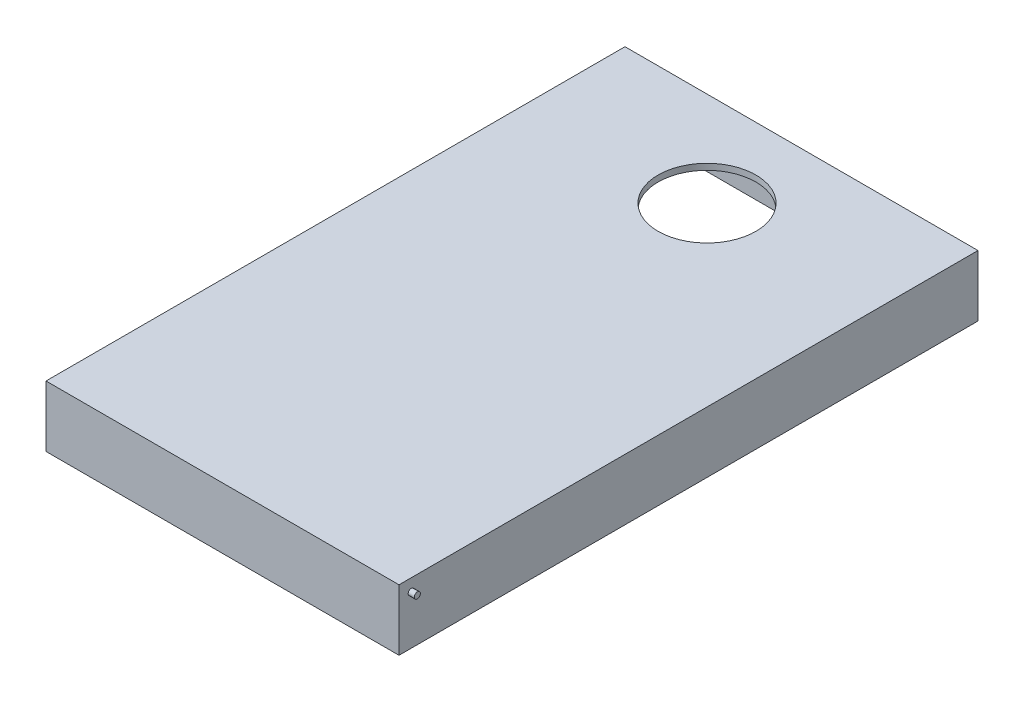
ISO-10303-21;
HEADER;
FILE_DESCRIPTION(('STEP AP214'),'2;1');
FILE_NAME('part.step','',(''),(''),'','','');
FILE_SCHEMA(('AUTOMOTIVE_DESIGN { 1 0 10303 214 1 1 1 1 }'));
ENDSEC;
DATA;
#1=APPLICATION_CONTEXT('core data for automotive mechanical design processes');
#2=APPLICATION_PROTOCOL_DEFINITION('international standard','automotive_design',2000,#1);
#3=PRODUCT_CONTEXT('',#1,'mechanical');
#4=PRODUCT('Part','Part','',(#3));
#5=PRODUCT_RELATED_PRODUCT_CATEGORY('part','',(#4));
#6=PRODUCT_DEFINITION_FORMATION('','',#4);
#7=PRODUCT_DEFINITION_CONTEXT('part definition',#1,'design');
#8=PRODUCT_DEFINITION('design','',#6,#7);
#9=PRODUCT_DEFINITION_SHAPE('','',#8);
#10=(LENGTH_UNIT() NAMED_UNIT(*) SI_UNIT(.MILLI.,.METRE.));
#11=(NAMED_UNIT(*) PLANE_ANGLE_UNIT() SI_UNIT($,.RADIAN.));
#12=(NAMED_UNIT(*) SI_UNIT($,.STERADIAN.) SOLID_ANGLE_UNIT());
#13=UNCERTAINTY_MEASURE_WITH_UNIT(LENGTH_MEASURE(1.E-05),#10,'distance_accuracy_value','');
#14=(GEOMETRIC_REPRESENTATION_CONTEXT(3) GLOBAL_UNCERTAINTY_ASSIGNED_CONTEXT((#13)) GLOBAL_UNIT_ASSIGNED_CONTEXT((#10,
#11,#12)) REPRESENTATION_CONTEXT('',''));
#15=CARTESIAN_POINT('',(0.,0.,0.));
#16=DIRECTION('',(0.,0.,1.));
#17=DIRECTION('',(1.,0.,0.));
#18=AXIS2_PLACEMENT_3D('',#15,#16,#17);
#19=CARTESIAN_POINT('',(0.,-10.,0.));
#20=DIRECTION('',(0.,-1.,0.));
#21=DIRECTION('',(0.,0.,-1.));
#22=AXIS2_PLACEMENT_3D('',#19,#20,#21);
#23=PLANE('',#22);
#24=DIRECTION('',(1.,0.,0.));
#25=VECTOR('',#24,1.);
#26=CARTESIAN_POINT('',(28.9,-10.,-24.0111111111109));
#27=LINE('',#26,#25);
#28=CARTESIAN_POINT('',(-28.9,-10.,-24.0111111111109));
#29=VERTEX_POINT('',#28);
#30=CARTESIAN_POINT('',(28.9,-10.,-24.0111111111109));
#31=VERTEX_POINT('',#30);
#32=EDGE_CURVE('E148',#29,#31,#27,.T.);
#33=ORIENTED_EDGE('',*,*,#32,.F.);
#34=DIRECTION('',(0.,0.,1.));
#35=VECTOR('',#34,1.);
#36=CARTESIAN_POINT('',(-28.9,-10.,-24.0111111111109));
#37=LINE('',#36,#35);
#38=CARTESIAN_POINT('',(-28.9,-10.,-118.811111111111));
#39=VERTEX_POINT('',#38);
#40=EDGE_CURVE('E156',#39,#29,#37,.T.);
#41=ORIENTED_EDGE('',*,*,#40,.F.);
#42=DIRECTION('',(-1.,0.,0.));
#43=VECTOR('',#42,1.);
#44=CARTESIAN_POINT('',(28.9,-10.,-118.811111111111));
#45=LINE('',#44,#43);
#46=CARTESIAN_POINT('',(28.9,-10.,-118.811111111111));
#47=VERTEX_POINT('',#46);
#48=EDGE_CURVE('E153',#47,#39,#45,.T.);
#49=ORIENTED_EDGE('',*,*,#48,.F.);
#50=DIRECTION('',(0.,0.,-1.));
#51=VECTOR('',#50,1.);
#52=CARTESIAN_POINT('',(28.9,-10.,-24.0111111111109));
#53=LINE('',#52,#51);
#54=EDGE_CURVE('E150',#31,#47,#53,.T.);
#55=ORIENTED_EDGE('',*,*,#54,.F.);
#56=EDGE_LOOP('',(#33,#41,#49,#55));
#57=FACE_BOUND('',#56,.T.);
#58=DIRECTION('',(0.,0.,1.));
#59=VECTOR('',#58,1.);
#60=CARTESIAN_POINT('',(-27.9,-10.,-24.0111111111109));
#61=LINE('',#60,#59);
#62=CARTESIAN_POINT('',(-27.9,-10.,-117.811111111111));
#63=VERTEX_POINT('',#62);
#64=CARTESIAN_POINT('',(-27.9,-10.,-25.0111111111109));
#65=VERTEX_POINT('',#64);
#66=EDGE_CURVE('E143',#63,#65,#61,.T.);
#67=ORIENTED_EDGE('',*,*,#66,.T.);
#68=DIRECTION('',(1.,0.,0.));
#69=VECTOR('',#68,1.);
#70=CARTESIAN_POINT('',(28.9,-10.,-25.0111111111109));
#71=LINE('',#70,#69);
#72=CARTESIAN_POINT('',(27.9,-10.,-25.0111111111109));
#73=VERTEX_POINT('',#72);
#74=EDGE_CURVE('E111',#65,#73,#71,.T.);
#75=ORIENTED_EDGE('',*,*,#74,.T.);
#76=DIRECTION('',(0.,0.,-1.));
#77=VECTOR('',#76,1.);
#78=CARTESIAN_POINT('',(27.9,-10.,-24.0111111111109));
#79=LINE('',#78,#77);
#80=CARTESIAN_POINT('',(27.9,-10.,-117.811111111111));
#81=VERTEX_POINT('',#80);
#82=EDGE_CURVE('E133',#73,#81,#79,.T.);
#83=ORIENTED_EDGE('',*,*,#82,.T.);
#84=DIRECTION('',(-1.,0.,0.));
#85=VECTOR('',#84,1.);
#86=CARTESIAN_POINT('',(28.9,-10.,-117.811111111111));
#87=LINE('',#86,#85);
#88=EDGE_CURVE('E48',#81,#63,#87,.T.);
#89=ORIENTED_EDGE('',*,*,#88,.T.);
#90=EDGE_LOOP('',(#67,#75,#83,#89));
#91=FACE_BOUND('',#90,.T.);
#92=ADVANCED_FACE('F33',(#57,#91),#23,.T.);
#93=CARTESIAN_POINT('',(28.9,-10.,-24.0111111111109));
#94=DIRECTION('',(0.,0.,1.));
#95=DIRECTION('',(1.,0.,0.));
#96=AXIS2_PLACEMENT_3D('',#93,#94,#95);
#97=PLANE('',#96);
#98=DIRECTION('',(1.,0.,0.));
#99=VECTOR('',#98,1.);
#100=CARTESIAN_POINT('',(28.9,0.,-24.0111111111109));
#101=LINE('',#100,#99);
#102=CARTESIAN_POINT('',(-28.9,0.,-24.0111111111109));
#103=VERTEX_POINT('',#102);
#104=CARTESIAN_POINT('',(28.9,0.,-24.0111111111109));
#105=VERTEX_POINT('',#104);
#106=EDGE_CURVE('E116',#103,#105,#101,.T.);
#107=ORIENTED_EDGE('',*,*,#106,.F.);
#108=DIRECTION('',(0.,1.,0.));
#109=VECTOR('',#108,1.);
#110=CARTESIAN_POINT('',(-28.9,-10.,-24.0111111111109));
#111=LINE('',#110,#109);
#112=EDGE_CURVE('E41',#29,#103,#111,.T.);
#113=ORIENTED_EDGE('',*,*,#112,.F.);
#114=ORIENTED_EDGE('',*,*,#32,.T.);
#115=DIRECTION('',(0.,1.,0.));
#116=VECTOR('',#115,1.);
#117=CARTESIAN_POINT('',(28.9,-10.,-24.0111111111109));
#118=LINE('',#117,#116);
#119=EDGE_CURVE('E82',#31,#105,#118,.T.);
#120=ORIENTED_EDGE('',*,*,#119,.T.);
#121=EDGE_LOOP('',(#107,#113,#114,#120));
#122=FACE_BOUND('',#121,.T.);
#123=ADVANCED_FACE('F35',(#122),#97,.T.);
#124=CARTESIAN_POINT('',(-28.9,-10.,-24.0111111111109));
#125=DIRECTION('',(-1.,0.,0.));
#126=DIRECTION('',(0.,0.,1.));
#127=AXIS2_PLACEMENT_3D('',#124,#125,#126);
#128=PLANE('',#127);
#129=CARTESIAN_POINT('',(-28.9,-2.,-26.0111111111109));
#130=DIRECTION('',(-1.,0.,0.));
#131=DIRECTION('',(0.,0.,1.));
#132=AXIS2_PLACEMENT_3D('',#129,#130,#131);
#133=CIRCLE('',#132,0.499999999999999);
#134=CARTESIAN_POINT('',(-28.9,-2.,-25.5111111111109));
#135=VERTEX_POINT('',#134);
#136=EDGE_CURVE('E11',#135,#135,#133,.T.);
#137=ORIENTED_EDGE('',*,*,#136,.F.);
#138=EDGE_LOOP('',(#137));
#139=FACE_BOUND('',#138,.T.);
#140=DIRECTION('',(0.,0.,1.));
#141=VECTOR('',#140,1.);
#142=CARTESIAN_POINT('',(-28.9,0.,-24.0111111111109));
#143=LINE('',#142,#141);
#144=CARTESIAN_POINT('',(-28.9,0.,-118.811111111111));
#145=VERTEX_POINT('',#144);
#146=EDGE_CURVE('E151',#145,#103,#143,.T.);
#147=ORIENTED_EDGE('',*,*,#146,.F.);
#148=DIRECTION('',(0.,1.,0.));
#149=VECTOR('',#148,1.);
#150=CARTESIAN_POINT('',(-28.9,-10.,-118.811111111111));
#151=LINE('',#150,#149);
#152=EDGE_CURVE('E169',#39,#145,#151,.T.);
#153=ORIENTED_EDGE('',*,*,#152,.F.);
#154=ORIENTED_EDGE('',*,*,#40,.T.);
#155=ORIENTED_EDGE('',*,*,#112,.T.);
#156=EDGE_LOOP('',(#147,#153,#154,#155));
#157=FACE_BOUND('',#156,.T.);
#158=ADVANCED_FACE('F209',(#139,#157),#128,.T.);
#159=CARTESIAN_POINT('',(28.9,-10.,-118.811111111111));
#160=DIRECTION('',(0.,0.,-1.));
#161=DIRECTION('',(-1.,0.,0.));
#162=AXIS2_PLACEMENT_3D('',#159,#160,#161);
#163=PLANE('',#162);
#164=DIRECTION('',(-1.,0.,0.));
#165=VECTOR('',#164,1.);
#166=CARTESIAN_POINT('',(28.9,0.,-118.811111111111));
#167=LINE('',#166,#165);
#168=CARTESIAN_POINT('',(28.9,0.,-118.811111111111));
#169=VERTEX_POINT('',#168);
#170=EDGE_CURVE('E163',#169,#145,#167,.T.);
#171=ORIENTED_EDGE('',*,*,#170,.F.);
#172=DIRECTION('',(0.,1.,0.));
#173=VECTOR('',#172,1.);
#174=CARTESIAN_POINT('',(28.9,-10.,-118.811111111111));
#175=LINE('',#174,#173);
#176=EDGE_CURVE('E171',#47,#169,#175,.T.);
#177=ORIENTED_EDGE('',*,*,#176,.F.);
#178=ORIENTED_EDGE('',*,*,#48,.T.);
#179=ORIENTED_EDGE('',*,*,#152,.T.);
#180=EDGE_LOOP('',(#171,#177,#178,#179));
#181=FACE_BOUND('',#180,.T.);
#182=ADVANCED_FACE('F221',(#181),#163,.T.);
#183=CARTESIAN_POINT('',(28.9,-10.,-24.0111111111109));
#184=DIRECTION('',(1.,0.,0.));
#185=DIRECTION('',(0.,0.,-1.));
#186=AXIS2_PLACEMENT_3D('',#183,#184,#185);
#187=PLANE('',#186);
#188=CARTESIAN_POINT('',(28.9,-2.,-26.0111111111109));
#189=DIRECTION('',(1.,0.,0.));
#190=DIRECTION('',(0.,0.,-1.));
#191=AXIS2_PLACEMENT_3D('',#188,#189,#190);
#192=CIRCLE('',#191,0.499999999999999);
#193=CARTESIAN_POINT('',(28.9,-2.,-26.5111111111109));
#194=VERTEX_POINT('',#193);
#195=EDGE_CURVE('E183',#194,#194,#192,.T.);
#196=ORIENTED_EDGE('',*,*,#195,.F.);
#197=EDGE_LOOP('',(#196));
#198=FACE_BOUND('',#197,.T.);
#199=DIRECTION('',(0.,0.,-1.));
#200=VECTOR('',#199,1.);
#201=CARTESIAN_POINT('',(28.9,0.,-24.0111111111109));
#202=LINE('',#201,#200);
#203=EDGE_CURVE('E160',#105,#169,#202,.T.);
#204=ORIENTED_EDGE('',*,*,#203,.F.);
#205=ORIENTED_EDGE('',*,*,#119,.F.);
#206=ORIENTED_EDGE('',*,*,#54,.T.);
#207=ORIENTED_EDGE('',*,*,#176,.T.);
#208=EDGE_LOOP('',(#204,#205,#206,#207));
#209=FACE_BOUND('',#208,.T.);
#210=ADVANCED_FACE('F217',(#198,#209),#187,.T.);
#211=CARTESIAN_POINT('',(0.,0.,0.));
#212=DIRECTION('',(0.,-1.,0.));
#213=DIRECTION('',(0.,0.,-1.));
#214=AXIS2_PLACEMENT_3D('',#211,#212,#213);
#215=PLANE('',#214);
#216=CARTESIAN_POINT('',(0.,0.,-103.340669907524));
#217=DIRECTION('',(0.,1.,0.));
#218=DIRECTION('',(0.,0.,1.));
#219=AXIS2_PLACEMENT_3D('',#216,#217,#218);
#220=CIRCLE('',#219,8.);
#221=CARTESIAN_POINT('',(0.,0.,-95.3406699075243));
#222=VERTEX_POINT('',#221);
#223=EDGE_CURVE('E174',#222,#222,#220,.T.);
#224=ORIENTED_EDGE('',*,*,#223,.F.);
#225=EDGE_LOOP('',(#224));
#226=FACE_BOUND('',#225,.T.);
#227=ORIENTED_EDGE('',*,*,#106,.T.);
#228=ORIENTED_EDGE('',*,*,#203,.T.);
#229=ORIENTED_EDGE('',*,*,#170,.T.);
#230=ORIENTED_EDGE('',*,*,#146,.T.);
#231=EDGE_LOOP('',(#227,#228,#229,#230));
#232=FACE_BOUND('',#231,.T.);
#233=ADVANCED_FACE('F214',(#226,#232),#215,.F.);
#234=CARTESIAN_POINT('',(28.9,-10.,-25.0111111111109));
#235=DIRECTION('',(0.,0.,1.));
#236=DIRECTION('',(1.,0.,0.));
#237=AXIS2_PLACEMENT_3D('',#234,#235,#236);
#238=PLANE('',#237);
#239=DIRECTION('',(1.,0.,0.));
#240=VECTOR('',#239,1.);
#241=CARTESIAN_POINT('',(28.9,-0.999999999999999,-25.0111111111109));
#242=LINE('',#241,#240);
#243=CARTESIAN_POINT('',(-27.9,-1.,-25.0111111111109));
#244=VERTEX_POINT('',#243);
#245=CARTESIAN_POINT('',(27.9,-1.,-25.0111111111109));
#246=VERTEX_POINT('',#245);
#247=EDGE_CURVE('E109',#244,#246,#242,.T.);
#248=ORIENTED_EDGE('',*,*,#247,.T.);
#249=DIRECTION('',(0.,1.,0.));
#250=VECTOR('',#249,1.);
#251=CARTESIAN_POINT('',(27.9,-10.,-25.0111111111109));
#252=LINE('',#251,#250);
#253=EDGE_CURVE('E138',#73,#246,#252,.T.);
#254=ORIENTED_EDGE('',*,*,#253,.F.);
#255=ORIENTED_EDGE('',*,*,#74,.F.);
#256=DIRECTION('',(0.,1.,0.));
#257=VECTOR('',#256,1.);
#258=CARTESIAN_POINT('',(-27.9,-10.,-25.0111111111109));
#259=LINE('',#258,#257);
#260=EDGE_CURVE('E106',#65,#244,#259,.T.);
#261=ORIENTED_EDGE('',*,*,#260,.T.);
#262=EDGE_LOOP('',(#248,#254,#255,#261));
#263=FACE_BOUND('',#262,.T.);
#264=ADVANCED_FACE('F108',(#263),#238,.F.);
#265=CARTESIAN_POINT('',(-27.9,-10.,-24.0111111111109));
#266=DIRECTION('',(-1.,0.,0.));
#267=DIRECTION('',(0.,0.,1.));
#268=AXIS2_PLACEMENT_3D('',#265,#266,#267);
#269=PLANE('',#268);
#270=DIRECTION('',(0.,0.,1.));
#271=VECTOR('',#270,1.);
#272=CARTESIAN_POINT('',(-27.9,-0.999999999999999,-24.0111111111109));
#273=LINE('',#272,#271);
#274=CARTESIAN_POINT('',(-27.9,-1.,-117.811111111111));
#275=VERTEX_POINT('',#274);
#276=EDGE_CURVE('E124',#275,#244,#273,.T.);
#277=ORIENTED_EDGE('',*,*,#276,.T.);
#278=ORIENTED_EDGE('',*,*,#260,.F.);
#279=ORIENTED_EDGE('',*,*,#66,.F.);
#280=DIRECTION('',(0.,1.,0.));
#281=VECTOR('',#280,1.);
#282=CARTESIAN_POINT('',(-27.9,-10.,-117.811111111111));
#283=LINE('',#282,#281);
#284=EDGE_CURVE('E117',#63,#275,#283,.T.);
#285=ORIENTED_EDGE('',*,*,#284,.T.);
#286=EDGE_LOOP('',(#277,#278,#279,#285));
#287=FACE_BOUND('',#286,.T.);
#288=ADVANCED_FACE('F129',(#287),#269,.F.);
#289=CARTESIAN_POINT('',(28.9,-10.,-117.811111111111));
#290=DIRECTION('',(0.,0.,-1.));
#291=DIRECTION('',(-1.,0.,0.));
#292=AXIS2_PLACEMENT_3D('',#289,#290,#291);
#293=PLANE('',#292);
#294=DIRECTION('',(-1.,0.,0.));
#295=VECTOR('',#294,1.);
#296=CARTESIAN_POINT('',(28.9,-0.999999999999999,-117.811111111111));
#297=LINE('',#296,#295);
#298=CARTESIAN_POINT('',(27.9,-1.,-117.811111111111));
#299=VERTEX_POINT('',#298);
#300=EDGE_CURVE('E131',#299,#275,#297,.T.);
#301=ORIENTED_EDGE('',*,*,#300,.T.);
#302=ORIENTED_EDGE('',*,*,#284,.F.);
#303=ORIENTED_EDGE('',*,*,#88,.F.);
#304=DIRECTION('',(0.,1.,0.));
#305=VECTOR('',#304,1.);
#306=CARTESIAN_POINT('',(27.9,-10.,-117.811111111111));
#307=LINE('',#306,#305);
#308=EDGE_CURVE('E139',#81,#299,#307,.T.);
#309=ORIENTED_EDGE('',*,*,#308,.T.);
#310=EDGE_LOOP('',(#301,#302,#303,#309));
#311=FACE_BOUND('',#310,.T.);
#312=ADVANCED_FACE('F253',(#311),#293,.F.);
#313=CARTESIAN_POINT('',(27.9,-10.,-24.0111111111109));
#314=DIRECTION('',(1.,0.,0.));
#315=DIRECTION('',(0.,0.,-1.));
#316=AXIS2_PLACEMENT_3D('',#313,#314,#315);
#317=PLANE('',#316);
#318=DIRECTION('',(0.,0.,-1.));
#319=VECTOR('',#318,1.);
#320=CARTESIAN_POINT('',(27.9,-0.999999999999999,-24.0111111111109));
#321=LINE('',#320,#319);
#322=EDGE_CURVE('E126',#246,#299,#321,.T.);
#323=ORIENTED_EDGE('',*,*,#322,.T.);
#324=ORIENTED_EDGE('',*,*,#308,.F.);
#325=ORIENTED_EDGE('',*,*,#82,.F.);
#326=ORIENTED_EDGE('',*,*,#253,.T.);
#327=EDGE_LOOP('',(#323,#324,#325,#326));
#328=FACE_BOUND('',#327,.T.);
#329=ADVANCED_FACE('F255',(#328),#317,.F.);
#330=CARTESIAN_POINT('',(0.,-1.,0.));
#331=DIRECTION('',(0.,-1.,0.));
#332=DIRECTION('',(0.,0.,-1.));
#333=AXIS2_PLACEMENT_3D('',#330,#331,#332);
#334=PLANE('',#333);
#335=CARTESIAN_POINT('',(0.,-0.999999999999999,-103.340669907524));
#336=DIRECTION('',(0.,-1.,0.));
#337=DIRECTION('',(0.,0.,-1.));
#338=AXIS2_PLACEMENT_3D('',#335,#336,#337);
#339=CIRCLE('',#338,8.);
#340=CARTESIAN_POINT('',(0.,-0.999999999999999,-111.340669907524));
#341=VERTEX_POINT('',#340);
#342=EDGE_CURVE('E127',#341,#341,#339,.T.);
#343=ORIENTED_EDGE('',*,*,#342,.F.);
#344=EDGE_LOOP('',(#343));
#345=FACE_BOUND('',#344,.T.);
#346=ORIENTED_EDGE('',*,*,#247,.F.);
#347=ORIENTED_EDGE('',*,*,#276,.F.);
#348=ORIENTED_EDGE('',*,*,#300,.F.);
#349=ORIENTED_EDGE('',*,*,#322,.F.);
#350=EDGE_LOOP('',(#346,#347,#348,#349));
#351=FACE_BOUND('',#350,.T.);
#352=ADVANCED_FACE('F122',(#345,#351),#334,.T.);
#353=CARTESIAN_POINT('',(0.,-10.,-103.340669907524));
#354=DIRECTION('',(0.,1.,0.));
#355=DIRECTION('',(0.,0.,1.));
#356=AXIS2_PLACEMENT_3D('',#353,#354,#355);
#357=CYLINDRICAL_SURFACE('',#356,8.);
#358=ORIENTED_EDGE('',*,*,#342,.T.);
#359=EDGE_LOOP('',(#358));
#360=FACE_BOUND('',#359,.T.);
#361=ORIENTED_EDGE('',*,*,#223,.T.);
#362=EDGE_LOOP('',(#361));
#363=FACE_BOUND('',#362,.T.);
#364=ADVANCED_FACE('F237',(#360,#363),#357,.F.);
#365=CARTESIAN_POINT('',(29.9,-2.,-26.0111111111109));
#366=DIRECTION('',(-1.,0.,0.));
#367=DIRECTION('',(0.,0.,1.));
#368=AXIS2_PLACEMENT_3D('',#365,#366,#367);
#369=CYLINDRICAL_SURFACE('',#368,0.499999999999999);
#370=CARTESIAN_POINT('',(29.9,-2.,-26.0111111111109));
#371=DIRECTION('',(1.,0.,0.));
#372=DIRECTION('',(0.,0.,-1.));
#373=AXIS2_PLACEMENT_3D('',#370,#371,#372);
#374=CIRCLE('',#373,0.499999999999999);
#375=CARTESIAN_POINT('',(29.9,-2.,-26.5111111111109));
#376=VERTEX_POINT('',#375);
#377=EDGE_CURVE('E178',#376,#376,#374,.T.);
#378=ORIENTED_EDGE('',*,*,#377,.F.);
#379=EDGE_LOOP('',(#378));
#380=FACE_BOUND('',#379,.T.);
#381=ORIENTED_EDGE('',*,*,#195,.T.);
#382=EDGE_LOOP('',(#381));
#383=FACE_BOUND('',#382,.T.);
#384=ADVANCED_FACE('F235',(#380,#383),#369,.T.);
#385=CARTESIAN_POINT('',(29.9,-2.,-26.0111111111109));
#386=DIRECTION('',(1.,0.,0.));
#387=DIRECTION('',(0.,0.,-1.));
#388=AXIS2_PLACEMENT_3D('',#385,#386,#387);
#389=PLANE('',#388);
#390=ORIENTED_EDGE('',*,*,#377,.T.);
#391=EDGE_LOOP('',(#390));
#392=FACE_BOUND('',#391,.T.);
#393=ADVANCED_FACE('F201',(#392),#389,.T.);
#394=CARTESIAN_POINT('',(-29.9,-2.,-26.0111111111109));
#395=DIRECTION('',(1.,0.,0.));
#396=DIRECTION('',(0.,0.,-1.));
#397=AXIS2_PLACEMENT_3D('',#394,#395,#396);
#398=CYLINDRICAL_SURFACE('',#397,0.499999999999999);
#399=CARTESIAN_POINT('',(-29.9,-2.,-26.0111111111109));
#400=DIRECTION('',(1.,0.,0.));
#401=DIRECTION('',(0.,0.,-1.));
#402=AXIS2_PLACEMENT_3D('',#399,#400,#401);
#403=CIRCLE('',#402,0.499999999999999);
#404=CARTESIAN_POINT('',(-29.9,-2.,-26.5111111111109));
#405=VERTEX_POINT('',#404);
#406=EDGE_CURVE('E187',#405,#405,#403,.T.);
#407=ORIENTED_EDGE('',*,*,#406,.T.);
#408=EDGE_LOOP('',(#407));
#409=FACE_BOUND('',#408,.T.);
#410=ORIENTED_EDGE('',*,*,#136,.T.);
#411=EDGE_LOOP('',(#410));
#412=FACE_BOUND('',#411,.T.);
#413=ADVANCED_FACE('F192',(#409,#412),#398,.T.);
#414=CARTESIAN_POINT('',(-29.9,-2.,-26.0111111111109));
#415=DIRECTION('',(-1.,0.,0.));
#416=DIRECTION('',(0.,0.,-1.));
#417=AXIS2_PLACEMENT_3D('',#414,#415,#416);
#418=PLANE('',#417);
#419=ORIENTED_EDGE('',*,*,#406,.F.);
#420=EDGE_LOOP('',(#419));
#421=FACE_BOUND('',#420,.T.);
#422=ADVANCED_FACE('F195',(#421),#418,.T.);
#423=CLOSED_SHELL('',(#92,#123,#158,#182,#210,#233,#264,#288,#312,#329,#352,#364,#384,#393,#413,#422));
#424=MANIFOLD_SOLID_BREP('B2',#423);
#425=ADVANCED_BREP_SHAPE_REPRESENTATION('',(#18,#424),#14);
#426=SHAPE_DEFINITION_REPRESENTATION(#9,#425);
ENDSEC;
END-ISO-10303-21;
